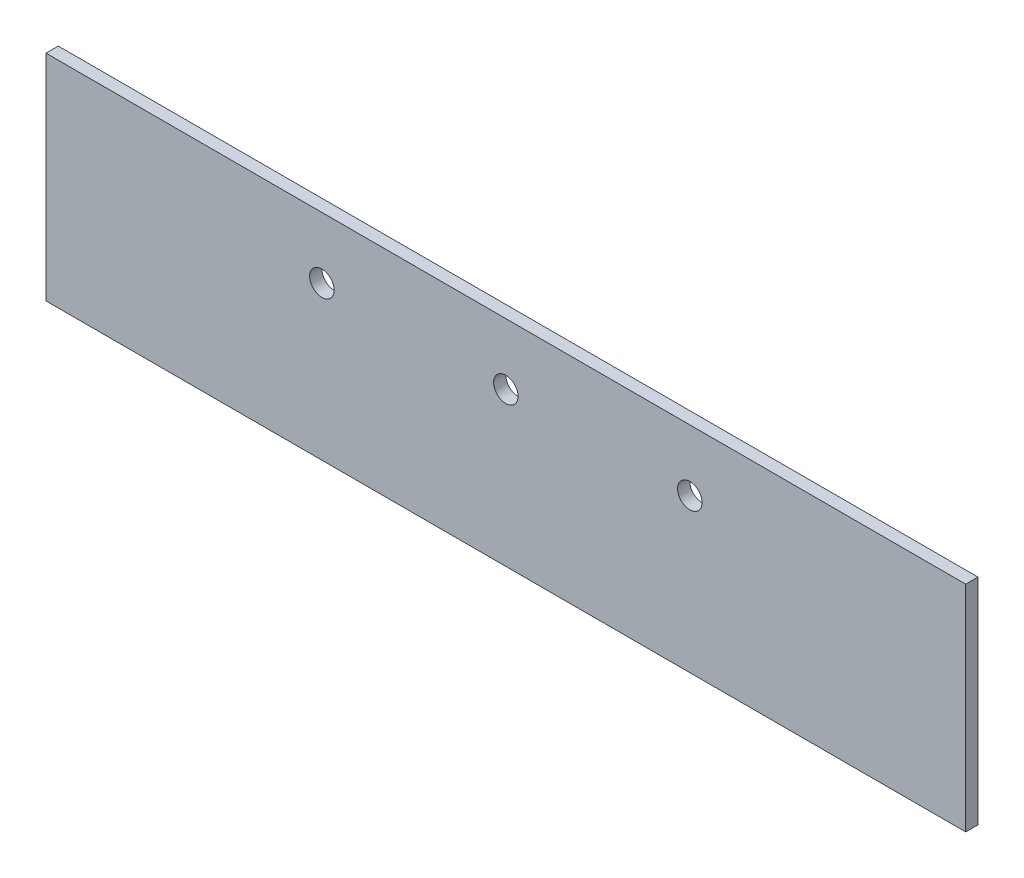
ISO-10303-21;
HEADER;
FILE_DESCRIPTION(('STEP AP214'),'2;1');
FILE_NAME('part.step','',(''),(''),'','','');
FILE_SCHEMA(('AUTOMOTIVE_DESIGN { 1 0 10303 214 1 1 1 1 }'));
ENDSEC;
DATA;
#1=APPLICATION_CONTEXT('core data for automotive mechanical design processes');
#2=APPLICATION_PROTOCOL_DEFINITION('international standard','automotive_design',2000,#1);
#3=PRODUCT_CONTEXT('',#1,'mechanical');
#4=PRODUCT('Part','Part','',(#3));
#5=PRODUCT_RELATED_PRODUCT_CATEGORY('part','',(#4));
#6=PRODUCT_DEFINITION_FORMATION('','',#4);
#7=PRODUCT_DEFINITION_CONTEXT('part definition',#1,'design');
#8=PRODUCT_DEFINITION('design','',#6,#7);
#9=PRODUCT_DEFINITION_SHAPE('','',#8);
#10=(LENGTH_UNIT() NAMED_UNIT(*) SI_UNIT(.MILLI.,.METRE.));
#11=(NAMED_UNIT(*) PLANE_ANGLE_UNIT() SI_UNIT($,.RADIAN.));
#12=(NAMED_UNIT(*) SI_UNIT($,.STERADIAN.) SOLID_ANGLE_UNIT());
#13=UNCERTAINTY_MEASURE_WITH_UNIT(LENGTH_MEASURE(1.E-05),#10,'distance_accuracy_value','');
#14=(GEOMETRIC_REPRESENTATION_CONTEXT(3) GLOBAL_UNCERTAINTY_ASSIGNED_CONTEXT((#13)) GLOBAL_UNIT_ASSIGNED_CONTEXT((#10,
#11,#12)) REPRESENTATION_CONTEXT('',''));
#15=CARTESIAN_POINT('',(0.,0.,0.));
#16=DIRECTION('',(0.,0.,1.));
#17=DIRECTION('',(1.,0.,0.));
#18=AXIS2_PLACEMENT_3D('',#15,#16,#17);
#19=CARTESIAN_POINT('',(75.,-17.5,2.));
#20=DIRECTION('',(-1.,0.,0.));
#21=DIRECTION('',(0.,0.,1.));
#22=AXIS2_PLACEMENT_3D('',#19,#20,#21);
#23=PLANE('',#22);
#24=DIRECTION('',(0.,1.,0.));
#25=VECTOR('',#24,1.);
#26=CARTESIAN_POINT('',(75.,-17.5,0.));
#27=LINE('',#26,#25);
#28=CARTESIAN_POINT('',(75.,-17.5,0.));
#29=VERTEX_POINT('',#28);
#30=CARTESIAN_POINT('',(75.,17.5,0.));
#31=VERTEX_POINT('',#30);
#32=EDGE_CURVE('E107',#29,#31,#27,.T.);
#33=ORIENTED_EDGE('',*,*,#32,.T.);
#34=DIRECTION('',(0.,0.,-1.));
#35=VECTOR('',#34,1.);
#36=CARTESIAN_POINT('',(75.,17.5,2.));
#37=LINE('',#36,#35);
#38=CARTESIAN_POINT('',(75.,17.5,2.));
#39=VERTEX_POINT('',#38);
#40=EDGE_CURVE('E11',#39,#31,#37,.T.);
#41=ORIENTED_EDGE('',*,*,#40,.F.);
#42=DIRECTION('',(0.,1.,0.));
#43=VECTOR('',#42,1.);
#44=CARTESIAN_POINT('',(75.,-17.5,2.));
#45=LINE('',#44,#43);
#46=CARTESIAN_POINT('',(75.,-17.5,2.));
#47=VERTEX_POINT('',#46);
#48=EDGE_CURVE('E91',#47,#39,#45,.T.);
#49=ORIENTED_EDGE('',*,*,#48,.F.);
#50=DIRECTION('',(0.,0.,-1.));
#51=VECTOR('',#50,1.);
#52=CARTESIAN_POINT('',(75.,-17.5,2.));
#53=LINE('',#52,#51);
#54=EDGE_CURVE('E103',#47,#29,#53,.T.);
#55=ORIENTED_EDGE('',*,*,#54,.T.);
#56=EDGE_LOOP('',(#33,#41,#49,#55));
#57=FACE_BOUND('',#56,.T.);
#58=ADVANCED_FACE('F39',(#57),#23,.F.);
#59=CARTESIAN_POINT('',(-75.,17.5,2.));
#60=DIRECTION('',(0.,-1.,0.));
#61=DIRECTION('',(0.,0.,-1.));
#62=AXIS2_PLACEMENT_3D('',#59,#60,#61);
#63=PLANE('',#62);
#64=DIRECTION('',(-1.,0.,0.));
#65=VECTOR('',#64,1.);
#66=CARTESIAN_POINT('',(-75.,17.5,0.));
#67=LINE('',#66,#65);
#68=CARTESIAN_POINT('',(-75.,17.5,0.));
#69=VERTEX_POINT('',#68);
#70=EDGE_CURVE('E96',#31,#69,#67,.T.);
#71=ORIENTED_EDGE('',*,*,#70,.T.);
#72=DIRECTION('',(0.,0.,-1.));
#73=VECTOR('',#72,1.);
#74=CARTESIAN_POINT('',(-75.,17.5,2.));
#75=LINE('',#74,#73);
#76=CARTESIAN_POINT('',(-75.,17.5,2.));
#77=VERTEX_POINT('',#76);
#78=EDGE_CURVE('E48',#77,#69,#75,.T.);
#79=ORIENTED_EDGE('',*,*,#78,.F.);
#80=DIRECTION('',(-1.,0.,0.));
#81=VECTOR('',#80,1.);
#82=CARTESIAN_POINT('',(-75.,17.5,2.));
#83=LINE('',#82,#81);
#84=EDGE_CURVE('E86',#39,#77,#83,.T.);
#85=ORIENTED_EDGE('',*,*,#84,.F.);
#86=ORIENTED_EDGE('',*,*,#40,.T.);
#87=EDGE_LOOP('',(#71,#79,#85,#86));
#88=FACE_BOUND('',#87,.T.);
#89=ADVANCED_FACE('F95',(#88),#63,.F.);
#90=CARTESIAN_POINT('',(-75.,-17.5,2.));
#91=DIRECTION('',(1.,0.,0.));
#92=DIRECTION('',(0.,0.,-1.));
#93=AXIS2_PLACEMENT_3D('',#90,#91,#92);
#94=PLANE('',#93);
#95=DIRECTION('',(0.,-1.,0.));
#96=VECTOR('',#95,1.);
#97=CARTESIAN_POINT('',(-75.,-17.5,0.));
#98=LINE('',#97,#96);
#99=CARTESIAN_POINT('',(-75.,-17.5,0.));
#100=VERTEX_POINT('',#99);
#101=EDGE_CURVE('E73',#69,#100,#98,.T.);
#102=ORIENTED_EDGE('',*,*,#101,.T.);
#103=DIRECTION('',(0.,0.,-1.));
#104=VECTOR('',#103,1.);
#105=CARTESIAN_POINT('',(-75.,-17.5,2.));
#106=LINE('',#105,#104);
#107=CARTESIAN_POINT('',(-75.,-17.5,2.));
#108=VERTEX_POINT('',#107);
#109=EDGE_CURVE('E98',#108,#100,#106,.T.);
#110=ORIENTED_EDGE('',*,*,#109,.F.);
#111=DIRECTION('',(0.,-1.,0.));
#112=VECTOR('',#111,1.);
#113=CARTESIAN_POINT('',(-75.,-17.5,2.));
#114=LINE('',#113,#112);
#115=EDGE_CURVE('E89',#77,#108,#114,.T.);
#116=ORIENTED_EDGE('',*,*,#115,.F.);
#117=ORIENTED_EDGE('',*,*,#78,.T.);
#118=EDGE_LOOP('',(#102,#110,#116,#117));
#119=FACE_BOUND('',#118,.T.);
#120=ADVANCED_FACE('F99',(#119),#94,.F.);
#121=CARTESIAN_POINT('',(-75.,-17.5,2.));
#122=DIRECTION('',(0.,1.,0.));
#123=DIRECTION('',(0.,0.,1.));
#124=AXIS2_PLACEMENT_3D('',#121,#122,#123);
#125=PLANE('',#124);
#126=DIRECTION('',(1.,0.,0.));
#127=VECTOR('',#126,1.);
#128=CARTESIAN_POINT('',(-75.,-17.5,0.));
#129=LINE('',#128,#127);
#130=EDGE_CURVE('E79',#100,#29,#129,.T.);
#131=ORIENTED_EDGE('',*,*,#130,.T.);
#132=ORIENTED_EDGE('',*,*,#54,.F.);
#133=DIRECTION('',(1.,0.,0.));
#134=VECTOR('',#133,1.);
#135=CARTESIAN_POINT('',(-75.,-17.5,2.));
#136=LINE('',#135,#134);
#137=EDGE_CURVE('E56',#108,#47,#136,.T.);
#138=ORIENTED_EDGE('',*,*,#137,.F.);
#139=ORIENTED_EDGE('',*,*,#109,.T.);
#140=EDGE_LOOP('',(#131,#132,#138,#139));
#141=FACE_BOUND('',#140,.T.);
#142=ADVANCED_FACE('F121',(#141),#125,.F.);
#143=CARTESIAN_POINT('',(0.,0.,2.));
#144=DIRECTION('',(0.,0.,-1.));
#145=DIRECTION('',(-1.,0.,0.));
#146=AXIS2_PLACEMENT_3D('',#143,#144,#145);
#147=PLANE('',#146);
#148=CARTESIAN_POINT('',(-30.,7.50000000000001,2.));
#149=DIRECTION('',(0.,0.,-1.));
#150=DIRECTION('',(1.,0.,0.));
#151=AXIS2_PLACEMENT_3D('',#148,#149,#150);
#152=CIRCLE('',#151,2.);
#153=CARTESIAN_POINT('',(-28.,7.50000000000001,2.));
#154=VERTEX_POINT('',#153);
#155=EDGE_CURVE('E111',#154,#154,#152,.T.);
#156=ORIENTED_EDGE('',*,*,#155,.T.);
#157=EDGE_LOOP('',(#156));
#158=FACE_BOUND('',#157,.T.);
#159=CARTESIAN_POINT('',(30.,7.5,2.));
#160=DIRECTION('',(0.,0.,-1.));
#161=DIRECTION('',(-1.,0.,0.));
#162=AXIS2_PLACEMENT_3D('',#159,#160,#161);
#163=CIRCLE('',#162,2.);
#164=CARTESIAN_POINT('',(28.,7.5,2.));
#165=VERTEX_POINT('',#164);
#166=EDGE_CURVE('E140',#165,#165,#163,.T.);
#167=ORIENTED_EDGE('',*,*,#166,.T.);
#168=EDGE_LOOP('',(#167));
#169=FACE_BOUND('',#168,.T.);
#170=CARTESIAN_POINT('',(0.,7.5,2.));
#171=DIRECTION('',(0.,0.,-1.));
#172=DIRECTION('',(-1.,0.,0.));
#173=AXIS2_PLACEMENT_3D('',#170,#171,#172);
#174=CIRCLE('',#173,2.);
#175=CARTESIAN_POINT('',(-2.,7.5,2.));
#176=VERTEX_POINT('',#175);
#177=EDGE_CURVE('E132',#176,#176,#174,.T.);
#178=ORIENTED_EDGE('',*,*,#177,.T.);
#179=EDGE_LOOP('',(#178));
#180=FACE_BOUND('',#179,.T.);
#181=ORIENTED_EDGE('',*,*,#48,.T.);
#182=ORIENTED_EDGE('',*,*,#84,.T.);
#183=ORIENTED_EDGE('',*,*,#115,.T.);
#184=ORIENTED_EDGE('',*,*,#137,.T.);
#185=EDGE_LOOP('',(#181,#182,#183,#184));
#186=FACE_BOUND('',#185,.T.);
#187=ADVANCED_FACE('F87',(#158,#169,#180,#186),#147,.F.);
#188=CARTESIAN_POINT('',(0.,0.,0.));
#189=DIRECTION('',(0.,0.,-1.));
#190=DIRECTION('',(-1.,0.,0.));
#191=AXIS2_PLACEMENT_3D('',#188,#189,#190);
#192=PLANE('',#191);
#193=CARTESIAN_POINT('',(-30.,7.50000000000001,0.));
#194=DIRECTION('',(0.,0.,-1.));
#195=DIRECTION('',(1.,0.,0.));
#196=AXIS2_PLACEMENT_3D('',#193,#194,#195);
#197=CIRCLE('',#196,2.);
#198=CARTESIAN_POINT('',(-28.,7.50000000000001,0.));
#199=VERTEX_POINT('',#198);
#200=EDGE_CURVE('E144',#199,#199,#197,.T.);
#201=ORIENTED_EDGE('',*,*,#200,.F.);
#202=EDGE_LOOP('',(#201));
#203=FACE_BOUND('',#202,.T.);
#204=CARTESIAN_POINT('',(30.,7.5,0.));
#205=DIRECTION('',(0.,0.,-1.));
#206=DIRECTION('',(-1.,0.,0.));
#207=AXIS2_PLACEMENT_3D('',#204,#205,#206);
#208=CIRCLE('',#207,2.);
#209=CARTESIAN_POINT('',(28.,7.5,0.));
#210=VERTEX_POINT('',#209);
#211=EDGE_CURVE('E136',#210,#210,#208,.T.);
#212=ORIENTED_EDGE('',*,*,#211,.F.);
#213=EDGE_LOOP('',(#212));
#214=FACE_BOUND('',#213,.T.);
#215=CARTESIAN_POINT('',(0.,7.5,0.));
#216=DIRECTION('',(0.,0.,-1.));
#217=DIRECTION('',(-1.,0.,0.));
#218=AXIS2_PLACEMENT_3D('',#215,#216,#217);
#219=CIRCLE('',#218,2.);
#220=CARTESIAN_POINT('',(-2.,7.5,0.));
#221=VERTEX_POINT('',#220);
#222=EDGE_CURVE('E128',#221,#221,#219,.T.);
#223=ORIENTED_EDGE('',*,*,#222,.F.);
#224=EDGE_LOOP('',(#223));
#225=FACE_BOUND('',#224,.T.);
#226=ORIENTED_EDGE('',*,*,#32,.F.);
#227=ORIENTED_EDGE('',*,*,#130,.F.);
#228=ORIENTED_EDGE('',*,*,#101,.F.);
#229=ORIENTED_EDGE('',*,*,#70,.F.);
#230=EDGE_LOOP('',(#226,#227,#228,#229));
#231=FACE_BOUND('',#230,.T.);
#232=ADVANCED_FACE('F124',(#203,#214,#225,#231),#192,.T.);
#233=CARTESIAN_POINT('',(0.,7.5,2.));
#234=DIRECTION('',(0.,0.,-1.));
#235=DIRECTION('',(-1.,0.,0.));
#236=AXIS2_PLACEMENT_3D('',#233,#234,#235);
#237=CYLINDRICAL_SURFACE('',#236,2.);
#238=ORIENTED_EDGE('',*,*,#177,.F.);
#239=EDGE_LOOP('',(#238));
#240=FACE_BOUND('',#239,.T.);
#241=ORIENTED_EDGE('',*,*,#222,.T.);
#242=EDGE_LOOP('',(#241));
#243=FACE_BOUND('',#242,.T.);
#244=ADVANCED_FACE('F163',(#240,#243),#237,.F.);
#245=CARTESIAN_POINT('',(30.,7.5,2.));
#246=DIRECTION('',(0.,0.,-1.));
#247=DIRECTION('',(-1.,0.,0.));
#248=AXIS2_PLACEMENT_3D('',#245,#246,#247);
#249=CYLINDRICAL_SURFACE('',#248,2.);
#250=ORIENTED_EDGE('',*,*,#166,.F.);
#251=EDGE_LOOP('',(#250));
#252=FACE_BOUND('',#251,.T.);
#253=ORIENTED_EDGE('',*,*,#211,.T.);
#254=EDGE_LOOP('',(#253));
#255=FACE_BOUND('',#254,.T.);
#256=ADVANCED_FACE('F157',(#252,#255),#249,.F.);
#257=CARTESIAN_POINT('',(-30.,7.50000000000001,2.));
#258=DIRECTION('',(0.,0.,-1.));
#259=DIRECTION('',(-1.,0.,0.));
#260=AXIS2_PLACEMENT_3D('',#257,#258,#259);
#261=CYLINDRICAL_SURFACE('',#260,2.);
#262=ORIENTED_EDGE('',*,*,#155,.F.);
#263=EDGE_LOOP('',(#262));
#264=FACE_BOUND('',#263,.T.);
#265=ORIENTED_EDGE('',*,*,#200,.T.);
#266=EDGE_LOOP('',(#265));
#267=FACE_BOUND('',#266,.T.);
#268=ADVANCED_FACE('F154',(#264,#267),#261,.F.);
#269=CLOSED_SHELL('',(#58,#89,#120,#142,#187,#232,#244,#256,#268));
#270=MANIFOLD_SOLID_BREP('B2',#269);
#271=ADVANCED_BREP_SHAPE_REPRESENTATION('',(#18,#270),#14);
#272=SHAPE_DEFINITION_REPRESENTATION(#9,#271);
ENDSEC;
END-ISO-10303-21;
